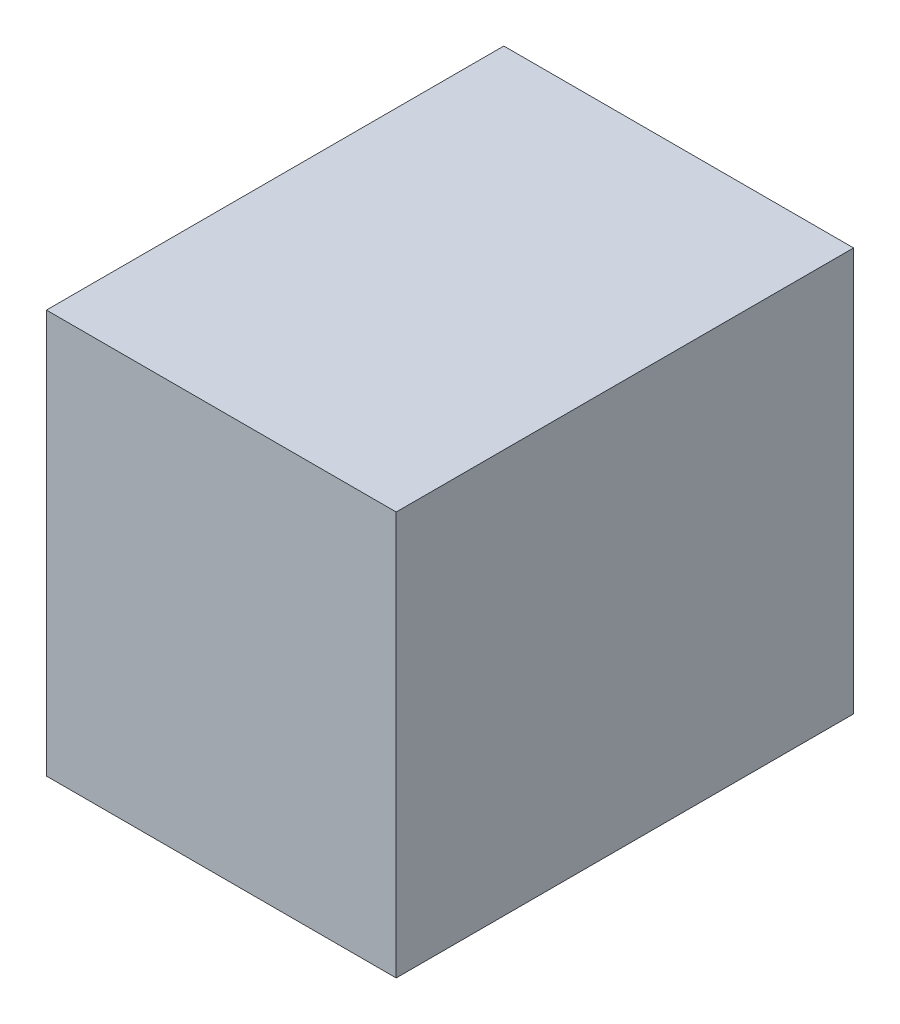
ISO-10303-21;
HEADER;
FILE_DESCRIPTION(('STEP AP214'),'2;1');
FILE_NAME('part.step','',(''),(''),'','','');
FILE_SCHEMA(('AUTOMOTIVE_DESIGN { 1 0 10303 214 1 1 1 1 }'));
ENDSEC;
DATA;
#1=APPLICATION_CONTEXT('core data for automotive mechanical design processes');
#2=APPLICATION_PROTOCOL_DEFINITION('international standard','automotive_design',2000,#1);
#3=PRODUCT_CONTEXT('',#1,'mechanical');
#4=PRODUCT('Part','Part','',(#3));
#5=PRODUCT_RELATED_PRODUCT_CATEGORY('part','',(#4));
#6=PRODUCT_DEFINITION_FORMATION('','',#4);
#7=PRODUCT_DEFINITION_CONTEXT('part definition',#1,'design');
#8=PRODUCT_DEFINITION('design','',#6,#7);
#9=PRODUCT_DEFINITION_SHAPE('','',#8);
#10=(LENGTH_UNIT() NAMED_UNIT(*) SI_UNIT(.MILLI.,.METRE.));
#11=(NAMED_UNIT(*) PLANE_ANGLE_UNIT() SI_UNIT($,.RADIAN.));
#12=(NAMED_UNIT(*) SI_UNIT($,.STERADIAN.) SOLID_ANGLE_UNIT());
#13=UNCERTAINTY_MEASURE_WITH_UNIT(LENGTH_MEASURE(1.E-05),#10,'distance_accuracy_value','');
#14=(GEOMETRIC_REPRESENTATION_CONTEXT(3) GLOBAL_UNCERTAINTY_ASSIGNED_CONTEXT((#13)) GLOBAL_UNIT_ASSIGNED_CONTEXT((#10,
#11,#12)) REPRESENTATION_CONTEXT('',''));
#15=CARTESIAN_POINT('',(0.,0.,0.));
#16=DIRECTION('',(0.,0.,1.));
#17=DIRECTION('',(1.,0.,0.));
#18=AXIS2_PLACEMENT_3D('',#15,#16,#17);
#19=CARTESIAN_POINT('',(6.5,15.,8.5));
#20=DIRECTION('',(-1.,0.,0.));
#21=DIRECTION('',(0.,0.,1.));
#22=AXIS2_PLACEMENT_3D('',#19,#20,#21);
#23=PLANE('',#22);
#24=DIRECTION('',(0.,0.,-1.));
#25=VECTOR('',#24,1.);
#26=CARTESIAN_POINT('',(6.5,0.,8.5));
#27=LINE('',#26,#25);
#28=CARTESIAN_POINT('',(6.5,0.,8.5));
#29=VERTEX_POINT('',#28);
#30=CARTESIAN_POINT('',(6.5,0.,-8.5));
#31=VERTEX_POINT('',#30);
#32=EDGE_CURVE('E110',#29,#31,#27,.T.);
#33=ORIENTED_EDGE('',*,*,#32,.T.);
#34=DIRECTION('',(0.,-1.,0.));
#35=VECTOR('',#34,1.);
#36=CARTESIAN_POINT('',(6.5,15.,-8.5));
#37=LINE('',#36,#35);
#38=CARTESIAN_POINT('',(6.5,15.,-8.5));
#39=VERTEX_POINT('',#38);
#40=EDGE_CURVE('E11',#39,#31,#37,.T.);
#41=ORIENTED_EDGE('',*,*,#40,.F.);
#42=DIRECTION('',(0.,0.,-1.));
#43=VECTOR('',#42,1.);
#44=CARTESIAN_POINT('',(6.5,15.,8.5));
#45=LINE('',#44,#43);
#46=CARTESIAN_POINT('',(6.5,15.,8.5));
#47=VERTEX_POINT('',#46);
#48=EDGE_CURVE('E97',#47,#39,#45,.T.);
#49=ORIENTED_EDGE('',*,*,#48,.F.);
#50=DIRECTION('',(0.,-1.,0.));
#51=VECTOR('',#50,1.);
#52=CARTESIAN_POINT('',(6.5,15.,8.5));
#53=LINE('',#52,#51);
#54=EDGE_CURVE('E106',#47,#29,#53,.T.);
#55=ORIENTED_EDGE('',*,*,#54,.T.);
#56=EDGE_LOOP('',(#33,#41,#49,#55));
#57=FACE_BOUND('',#56,.T.);
#58=ADVANCED_FACE('F42',(#57),#23,.F.);
#59=CARTESIAN_POINT('',(-6.5,15.,-8.5));
#60=DIRECTION('',(0.,0.,1.));
#61=DIRECTION('',(1.,0.,0.));
#62=AXIS2_PLACEMENT_3D('',#59,#60,#61);
#63=PLANE('',#62);
#64=DIRECTION('',(-1.,0.,0.));
#65=VECTOR('',#64,1.);
#66=CARTESIAN_POINT('',(-6.5,0.,-8.5));
#67=LINE('',#66,#65);
#68=CARTESIAN_POINT('',(-6.5,0.,-8.5));
#69=VERTEX_POINT('',#68);
#70=EDGE_CURVE('E101',#31,#69,#67,.T.);
#71=ORIENTED_EDGE('',*,*,#70,.T.);
#72=DIRECTION('',(0.,-1.,0.));
#73=VECTOR('',#72,1.);
#74=CARTESIAN_POINT('',(-6.5,15.,-8.5));
#75=LINE('',#74,#73);
#76=CARTESIAN_POINT('',(-6.5,15.,-8.5));
#77=VERTEX_POINT('',#76);
#78=EDGE_CURVE('E51',#77,#69,#75,.T.);
#79=ORIENTED_EDGE('',*,*,#78,.F.);
#80=DIRECTION('',(-1.,0.,0.));
#81=VECTOR('',#80,1.);
#82=CARTESIAN_POINT('',(-6.5,15.,-8.5));
#83=LINE('',#82,#81);
#84=EDGE_CURVE('E92',#39,#77,#83,.T.);
#85=ORIENTED_EDGE('',*,*,#84,.F.);
#86=ORIENTED_EDGE('',*,*,#40,.T.);
#87=EDGE_LOOP('',(#71,#79,#85,#86));
#88=FACE_BOUND('',#87,.T.);
#89=ADVANCED_FACE('F100',(#88),#63,.F.);
#90=CARTESIAN_POINT('',(-6.5,15.,8.5));
#91=DIRECTION('',(1.,0.,0.));
#92=DIRECTION('',(0.,0.,-1.));
#93=AXIS2_PLACEMENT_3D('',#90,#91,#92);
#94=PLANE('',#93);
#95=DIRECTION('',(0.,0.,1.));
#96=VECTOR('',#95,1.);
#97=CARTESIAN_POINT('',(-6.5,0.,8.5));
#98=LINE('',#97,#96);
#99=CARTESIAN_POINT('',(-6.5,0.,8.5));
#100=VERTEX_POINT('',#99);
#101=EDGE_CURVE('E79',#69,#100,#98,.T.);
#102=ORIENTED_EDGE('',*,*,#101,.T.);
#103=DIRECTION('',(0.,-1.,0.));
#104=VECTOR('',#103,1.);
#105=CARTESIAN_POINT('',(-6.5,15.,8.5));
#106=LINE('',#105,#104);
#107=CARTESIAN_POINT('',(-6.5,15.,8.5));
#108=VERTEX_POINT('',#107);
#109=EDGE_CURVE('E103',#108,#100,#106,.T.);
#110=ORIENTED_EDGE('',*,*,#109,.F.);
#111=DIRECTION('',(0.,0.,1.));
#112=VECTOR('',#111,1.);
#113=CARTESIAN_POINT('',(-6.5,15.,8.5));
#114=LINE('',#113,#112);
#115=EDGE_CURVE('E95',#77,#108,#114,.T.);
#116=ORIENTED_EDGE('',*,*,#115,.F.);
#117=ORIENTED_EDGE('',*,*,#78,.T.);
#118=EDGE_LOOP('',(#102,#110,#116,#117));
#119=FACE_BOUND('',#118,.T.);
#120=ADVANCED_FACE('F104',(#119),#94,.F.);
#121=CARTESIAN_POINT('',(-6.5,15.,8.5));
#122=DIRECTION('',(0.,0.,-1.));
#123=DIRECTION('',(-1.,0.,0.));
#124=AXIS2_PLACEMENT_3D('',#121,#122,#123);
#125=PLANE('',#124);
#126=DIRECTION('',(1.,0.,0.));
#127=VECTOR('',#126,1.);
#128=CARTESIAN_POINT('',(-6.5,0.,8.5));
#129=LINE('',#128,#127);
#130=EDGE_CURVE('E85',#100,#29,#129,.T.);
#131=ORIENTED_EDGE('',*,*,#130,.T.);
#132=ORIENTED_EDGE('',*,*,#54,.F.);
#133=DIRECTION('',(1.,0.,0.));
#134=VECTOR('',#133,1.);
#135=CARTESIAN_POINT('',(-6.5,15.,8.5));
#136=LINE('',#135,#134);
#137=EDGE_CURVE('E59',#108,#47,#136,.T.);
#138=ORIENTED_EDGE('',*,*,#137,.F.);
#139=ORIENTED_EDGE('',*,*,#109,.T.);
#140=EDGE_LOOP('',(#131,#132,#138,#139));
#141=FACE_BOUND('',#140,.T.);
#142=ADVANCED_FACE('F123',(#141),#125,.F.);
#143=CARTESIAN_POINT('',(0.,15.,0.));
#144=DIRECTION('',(0.,-1.,0.));
#145=DIRECTION('',(0.,0.,-1.));
#146=AXIS2_PLACEMENT_3D('',#143,#144,#145);
#147=PLANE('',#146);
#148=ORIENTED_EDGE('',*,*,#48,.T.);
#149=ORIENTED_EDGE('',*,*,#84,.T.);
#150=ORIENTED_EDGE('',*,*,#115,.T.);
#151=ORIENTED_EDGE('',*,*,#137,.T.);
#152=EDGE_LOOP('',(#148,#149,#150,#151));
#153=FACE_BOUND('',#152,.T.);
#154=ADVANCED_FACE('F93',(#153),#147,.F.);
#155=CARTESIAN_POINT('',(0.,0.,0.));
#156=DIRECTION('',(0.,-1.,0.));
#157=DIRECTION('',(0.,0.,-1.));
#158=AXIS2_PLACEMENT_3D('',#155,#156,#157);
#159=PLANE('',#158);
#160=ORIENTED_EDGE('',*,*,#32,.F.);
#161=ORIENTED_EDGE('',*,*,#130,.F.);
#162=ORIENTED_EDGE('',*,*,#101,.F.);
#163=ORIENTED_EDGE('',*,*,#70,.F.);
#164=EDGE_LOOP('',(#160,#161,#162,#163));
#165=FACE_BOUND('',#164,.T.);
#166=ADVANCED_FACE('F126',(#165),#159,.T.);
#167=CLOSED_SHELL('',(#58,#89,#120,#142,#154,#166));
#168=MANIFOLD_SOLID_BREP('B2',#167);
#169=ADVANCED_BREP_SHAPE_REPRESENTATION('',(#18,#168),#14);
#170=SHAPE_DEFINITION_REPRESENTATION(#9,#169);
ENDSEC;
END-ISO-10303-21;
